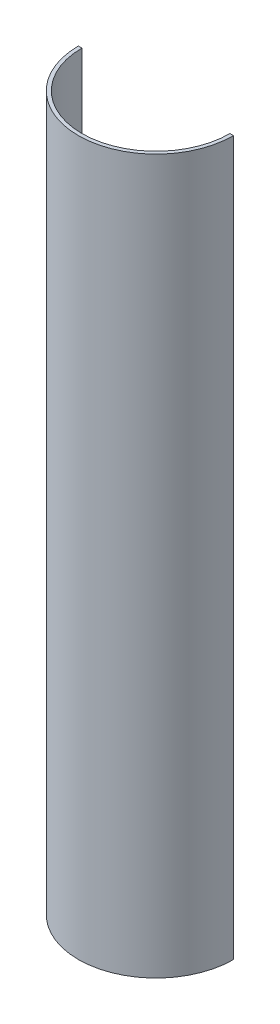
ISO-10303-21;
HEADER;
FILE_DESCRIPTION(('STEP AP214'),'2;1');
FILE_NAME('part.step','',(''),(''),'','','');
FILE_SCHEMA(('AUTOMOTIVE_DESIGN { 1 0 10303 214 1 1 1 1 }'));
ENDSEC;
DATA;
#1=APPLICATION_CONTEXT('core data for automotive mechanical design processes');
#2=APPLICATION_PROTOCOL_DEFINITION('international standard','automotive_design',2000,#1);
#3=PRODUCT_CONTEXT('',#1,'mechanical');
#4=PRODUCT('Part','Part','',(#3));
#5=PRODUCT_RELATED_PRODUCT_CATEGORY('part','',(#4));
#6=PRODUCT_DEFINITION_FORMATION('','',#4);
#7=PRODUCT_DEFINITION_CONTEXT('part definition',#1,'design');
#8=PRODUCT_DEFINITION('design','',#6,#7);
#9=PRODUCT_DEFINITION_SHAPE('','',#8);
#10=(LENGTH_UNIT() NAMED_UNIT(*) SI_UNIT(.MILLI.,.METRE.));
#11=(NAMED_UNIT(*) PLANE_ANGLE_UNIT() SI_UNIT($,.RADIAN.));
#12=(NAMED_UNIT(*) SI_UNIT($,.STERADIAN.) SOLID_ANGLE_UNIT());
#13=UNCERTAINTY_MEASURE_WITH_UNIT(LENGTH_MEASURE(1.E-05),#10,'distance_accuracy_value','');
#14=(GEOMETRIC_REPRESENTATION_CONTEXT(3) GLOBAL_UNCERTAINTY_ASSIGNED_CONTEXT((#13)) GLOBAL_UNIT_ASSIGNED_CONTEXT((#10,
#11,#12)) REPRESENTATION_CONTEXT('',''));
#15=CARTESIAN_POINT('',(0.,0.,0.));
#16=DIRECTION('',(0.,0.,1.));
#17=DIRECTION('',(1.,0.,0.));
#18=AXIS2_PLACEMENT_3D('',#15,#16,#17);
#19=CARTESIAN_POINT('',(42.5,400.,0.));
#20=DIRECTION('',(0.,-1.,0.));
#21=DIRECTION('',(0.,0.,-1.));
#22=AXIS2_PLACEMENT_3D('',#19,#20,#21);
#23=CYLINDRICAL_SURFACE('',#22,41.5);
#24=CARTESIAN_POINT('',(42.5,0.,0.));
#25=DIRECTION('',(0.,-1.,0.));
#26=DIRECTION('',(0.,0.,-1.));
#27=AXIS2_PLACEMENT_3D('',#24,#25,#26);
#28=CIRCLE('',#27,41.5);
#29=CARTESIAN_POINT('',(84.,0.,0.));
#30=VERTEX_POINT('',#29);
#31=CARTESIAN_POINT('',(1.,0.,0.));
#32=VERTEX_POINT('',#31);
#33=EDGE_CURVE('E96',#30,#32,#28,.T.);
#34=ORIENTED_EDGE('',*,*,#33,.T.);
#35=DIRECTION('',(0.,-1.,0.));
#36=VECTOR('',#35,1.);
#37=CARTESIAN_POINT('',(1.,400.,0.));
#38=LINE('',#37,#36);
#39=CARTESIAN_POINT('',(1.,400.,0.));
#40=VERTEX_POINT('',#39);
#41=EDGE_CURVE('E11',#40,#32,#38,.T.);
#42=ORIENTED_EDGE('',*,*,#41,.F.);
#43=CARTESIAN_POINT('',(42.5,400.,0.));
#44=DIRECTION('',(0.,-1.,0.));
#45=DIRECTION('',(0.,0.,-1.));
#46=AXIS2_PLACEMENT_3D('',#43,#44,#45);
#47=CIRCLE('',#46,41.5);
#48=CARTESIAN_POINT('',(84.,400.,0.));
#49=VERTEX_POINT('',#48);
#50=EDGE_CURVE('E84',#49,#40,#47,.T.);
#51=ORIENTED_EDGE('',*,*,#50,.F.);
#52=DIRECTION('',(0.,-1.,0.));
#53=VECTOR('',#52,1.);
#54=CARTESIAN_POINT('',(84.,400.,0.));
#55=LINE('',#54,#53);
#56=EDGE_CURVE('E92',#49,#30,#55,.T.);
#57=ORIENTED_EDGE('',*,*,#56,.T.);
#58=EDGE_LOOP('',(#34,#42,#51,#57));
#59=FACE_BOUND('',#58,.T.);
#60=ADVANCED_FACE('F33',(#59),#23,.F.);
#61=CARTESIAN_POINT('',(-1.,400.,0.));
#62=DIRECTION('',(0.,0.,1.));
#63=DIRECTION('',(1.,0.,0.));
#64=AXIS2_PLACEMENT_3D('',#61,#62,#63);
#65=PLANE('',#64);
#66=DIRECTION('',(-1.,0.,0.));
#67=VECTOR('',#66,1.);
#68=CARTESIAN_POINT('',(-1.,0.,0.));
#69=LINE('',#68,#67);
#70=CARTESIAN_POINT('',(-1.,0.,0.));
#71=VERTEX_POINT('',#70);
#72=EDGE_CURVE('E88',#32,#71,#69,.T.);
#73=ORIENTED_EDGE('',*,*,#72,.T.);
#74=DIRECTION('',(0.,-1.,0.));
#75=VECTOR('',#74,1.);
#76=CARTESIAN_POINT('',(-1.,400.,0.));
#77=LINE('',#76,#75);
#78=CARTESIAN_POINT('',(-1.,400.,0.));
#79=VERTEX_POINT('',#78);
#80=EDGE_CURVE('E41',#79,#71,#77,.T.);
#81=ORIENTED_EDGE('',*,*,#80,.F.);
#82=DIRECTION('',(-1.,0.,0.));
#83=VECTOR('',#82,1.);
#84=CARTESIAN_POINT('',(-1.,400.,0.));
#85=LINE('',#84,#83);
#86=EDGE_CURVE('E79',#40,#79,#85,.T.);
#87=ORIENTED_EDGE('',*,*,#86,.F.);
#88=ORIENTED_EDGE('',*,*,#41,.T.);
#89=EDGE_LOOP('',(#73,#81,#87,#88));
#90=FACE_BOUND('',#89,.T.);
#91=ADVANCED_FACE('F87',(#90),#65,.F.);
#92=CARTESIAN_POINT('',(42.5,400.,0.));
#93=DIRECTION('',(0.,-1.,0.));
#94=DIRECTION('',(0.,0.,-1.));
#95=AXIS2_PLACEMENT_3D('',#92,#93,#94);
#96=CYLINDRICAL_SURFACE('',#95,43.5);
#97=CARTESIAN_POINT('',(42.5,0.,0.));
#98=DIRECTION('',(0.,1.,0.));
#99=DIRECTION('',(0.,0.,-1.));
#100=AXIS2_PLACEMENT_3D('',#97,#98,#99);
#101=CIRCLE('',#100,43.5);
#102=CARTESIAN_POINT('',(86.,0.,0.));
#103=VERTEX_POINT('',#102);
#104=EDGE_CURVE('E66',#71,#103,#101,.T.);
#105=ORIENTED_EDGE('',*,*,#104,.T.);
#106=DIRECTION('',(0.,-1.,0.));
#107=VECTOR('',#106,1.);
#108=CARTESIAN_POINT('',(86.,400.,0.));
#109=LINE('',#108,#107);
#110=CARTESIAN_POINT('',(86.,400.,0.));
#111=VERTEX_POINT('',#110);
#112=EDGE_CURVE('E89',#111,#103,#109,.T.);
#113=ORIENTED_EDGE('',*,*,#112,.F.);
#114=CARTESIAN_POINT('',(42.5,400.,0.));
#115=DIRECTION('',(0.,1.,0.));
#116=DIRECTION('',(0.,0.,-1.));
#117=AXIS2_PLACEMENT_3D('',#114,#115,#116);
#118=CIRCLE('',#117,43.5);
#119=EDGE_CURVE('E82',#79,#111,#118,.T.);
#120=ORIENTED_EDGE('',*,*,#119,.F.);
#121=ORIENTED_EDGE('',*,*,#80,.T.);
#122=EDGE_LOOP('',(#105,#113,#120,#121));
#123=FACE_BOUND('',#122,.T.);
#124=ADVANCED_FACE('F90',(#123),#96,.T.);
#125=CARTESIAN_POINT('',(84.,400.,0.));
#126=DIRECTION('',(0.,0.,1.));
#127=DIRECTION('',(1.,0.,0.));
#128=AXIS2_PLACEMENT_3D('',#125,#126,#127);
#129=PLANE('',#128);
#130=DIRECTION('',(-1.,0.,0.));
#131=VECTOR('',#130,1.);
#132=CARTESIAN_POINT('',(84.,0.,0.));
#133=LINE('',#132,#131);
#134=EDGE_CURVE('E72',#103,#30,#133,.T.);
#135=ORIENTED_EDGE('',*,*,#134,.T.);
#136=ORIENTED_EDGE('',*,*,#56,.F.);
#137=DIRECTION('',(-1.,0.,0.));
#138=VECTOR('',#137,1.);
#139=CARTESIAN_POINT('',(84.,400.,0.));
#140=LINE('',#139,#138);
#141=EDGE_CURVE('E49',#111,#49,#140,.T.);
#142=ORIENTED_EDGE('',*,*,#141,.F.);
#143=ORIENTED_EDGE('',*,*,#112,.T.);
#144=EDGE_LOOP('',(#135,#136,#142,#143));
#145=FACE_BOUND('',#144,.T.);
#146=ADVANCED_FACE('F103',(#145),#129,.F.);
#147=CARTESIAN_POINT('',(42.5,400.,0.));
#148=DIRECTION('',(0.,-1.,0.));
#149=DIRECTION('',(0.,0.,-1.));
#150=AXIS2_PLACEMENT_3D('',#147,#148,#149);
#151=PLANE('',#150);
#152=ORIENTED_EDGE('',*,*,#50,.T.);
#153=ORIENTED_EDGE('',*,*,#86,.T.);
#154=ORIENTED_EDGE('',*,*,#119,.T.);
#155=ORIENTED_EDGE('',*,*,#141,.T.);
#156=EDGE_LOOP('',(#152,#153,#154,#155));
#157=FACE_BOUND('',#156,.T.);
#158=ADVANCED_FACE('F80',(#157),#151,.F.);
#159=CARTESIAN_POINT('',(42.5,0.,0.));
#160=DIRECTION('',(0.,-1.,0.));
#161=DIRECTION('',(0.,0.,-1.));
#162=AXIS2_PLACEMENT_3D('',#159,#160,#161);
#163=PLANE('',#162);
#164=ORIENTED_EDGE('',*,*,#33,.F.);
#165=ORIENTED_EDGE('',*,*,#134,.F.);
#166=ORIENTED_EDGE('',*,*,#104,.F.);
#167=ORIENTED_EDGE('',*,*,#72,.F.);
#168=EDGE_LOOP('',(#164,#165,#166,#167));
#169=FACE_BOUND('',#168,.T.);
#170=ADVANCED_FACE('F106',(#169),#163,.T.);
#171=CLOSED_SHELL('',(#60,#91,#124,#146,#158,#170));
#172=MANIFOLD_SOLID_BREP('B2',#171);
#173=ADVANCED_BREP_SHAPE_REPRESENTATION('',(#18,#172),#14);
#174=SHAPE_DEFINITION_REPRESENTATION(#9,#173);
ENDSEC;
END-ISO-10303-21;
